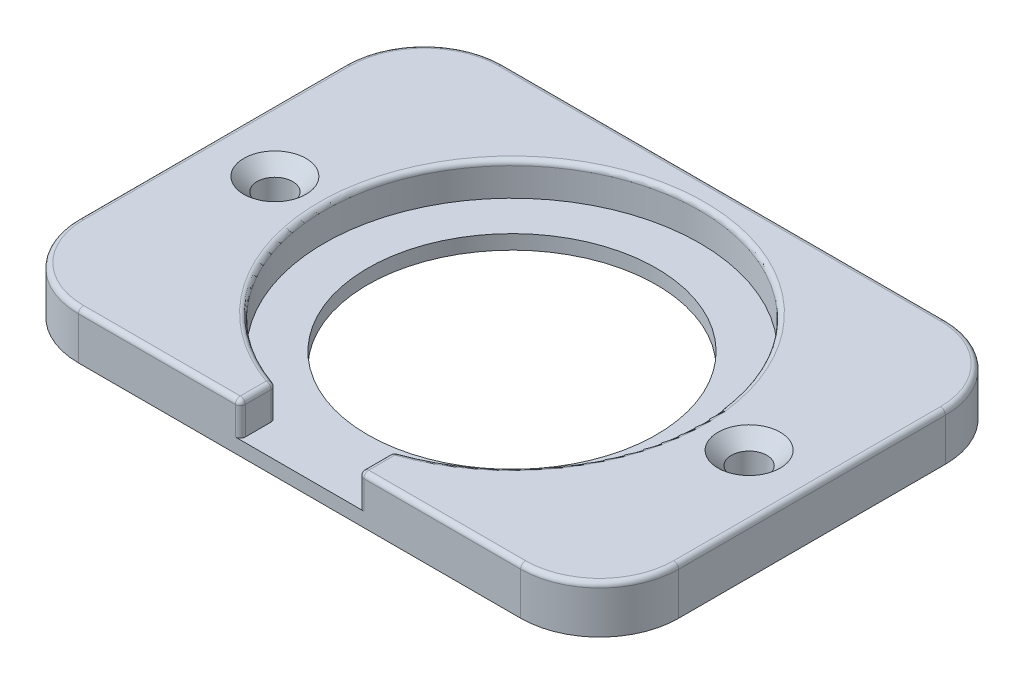
ISO-10303-21;
HEADER;
FILE_DESCRIPTION(('STEP AP214'),'2;1');
FILE_NAME('part.step','',(''),(''),'','','');
FILE_SCHEMA(('AUTOMOTIVE_DESIGN { 1 0 10303 214 1 1 1 1 }'));
ENDSEC;
DATA;
#1=APPLICATION_CONTEXT('core data for automotive mechanical design processes');
#2=APPLICATION_PROTOCOL_DEFINITION('international standard','automotive_design',2000,#1);
#3=PRODUCT_CONTEXT('',#1,'mechanical');
#4=PRODUCT('Part','Part','',(#3));
#5=PRODUCT_RELATED_PRODUCT_CATEGORY('part','',(#4));
#6=PRODUCT_DEFINITION_FORMATION('','',#4);
#7=PRODUCT_DEFINITION_CONTEXT('part definition',#1,'design');
#8=PRODUCT_DEFINITION('design','',#6,#7);
#9=PRODUCT_DEFINITION_SHAPE('','',#8);
#10=(LENGTH_UNIT() NAMED_UNIT(*) SI_UNIT(.MILLI.,.METRE.));
#11=(NAMED_UNIT(*) PLANE_ANGLE_UNIT() SI_UNIT($,.RADIAN.));
#12=(NAMED_UNIT(*) SI_UNIT($,.STERADIAN.) SOLID_ANGLE_UNIT());
#13=UNCERTAINTY_MEASURE_WITH_UNIT(LENGTH_MEASURE(1.E-05),#10,'distance_accuracy_value','');
#14=(GEOMETRIC_REPRESENTATION_CONTEXT(3) GLOBAL_UNCERTAINTY_ASSIGNED_CONTEXT((#13)) GLOBAL_UNIT_ASSIGNED_CONTEXT((#10,
#11,#12)) REPRESENTATION_CONTEXT('',''));
#15=CARTESIAN_POINT('',(0.,0.,0.));
#16=DIRECTION('',(0.,0.,1.));
#17=DIRECTION('',(1.,0.,0.));
#18=AXIS2_PLACEMENT_3D('',#15,#16,#17);
#19=CARTESIAN_POINT('',(30.375,4.8,21.5));
#20=DIRECTION('',(-1.,0.,0.));
#21=DIRECTION('',(0.,0.,1.));
#22=AXIS2_PLACEMENT_3D('',#19,#20,#21);
#23=PLANE('',#22);
#24=DIRECTION('',(0.,-1.,0.));
#25=VECTOR('',#24,1.);
#26=CARTESIAN_POINT('',(30.375,4.8,-13.5));
#27=LINE('',#26,#25);
#28=CARTESIAN_POINT('',(30.375,0.,-13.5));
#29=VERTEX_POINT('',#28);
#30=CARTESIAN_POINT('',(30.375,4.3,-13.5));
#31=VERTEX_POINT('',#30);
#32=EDGE_CURVE('E233',#29,#31,#27,.F.);
#33=ORIENTED_EDGE('',*,*,#32,.T.);
#34=DIRECTION('',(0.,0.,-1.));
#35=VECTOR('',#34,1.);
#36=CARTESIAN_POINT('',(30.375,4.3,21.5));
#37=LINE('',#36,#35);
#38=CARTESIAN_POINT('',(30.375,4.3,13.5));
#39=VERTEX_POINT('',#38);
#40=EDGE_CURVE('E278',#31,#39,#37,.F.);
#41=ORIENTED_EDGE('',*,*,#40,.T.);
#42=DIRECTION('',(0.,-1.,0.));
#43=VECTOR('',#42,1.);
#44=CARTESIAN_POINT('',(30.375,4.8,13.5));
#45=LINE('',#44,#43);
#46=CARTESIAN_POINT('',(30.375,0.,13.5));
#47=VERTEX_POINT('',#46);
#48=EDGE_CURVE('E231',#39,#47,#45,.T.);
#49=ORIENTED_EDGE('',*,*,#48,.T.);
#50=DIRECTION('',(0.,0.,-1.));
#51=VECTOR('',#50,1.);
#52=CARTESIAN_POINT('',(30.375,0.,21.5));
#53=LINE('',#52,#51);
#54=EDGE_CURVE('E220',#47,#29,#53,.T.);
#55=ORIENTED_EDGE('',*,*,#54,.T.);
#56=EDGE_LOOP('',(#33,#41,#49,#55));
#57=FACE_BOUND('',#56,.T.);
#58=ADVANCED_FACE('F37',(#57),#23,.F.);
#59=CARTESIAN_POINT('',(-30.375,4.8,-21.5));
#60=DIRECTION('',(0.,0.,1.));
#61=DIRECTION('',(1.,0.,0.));
#62=AXIS2_PLACEMENT_3D('',#59,#60,#61);
#63=PLANE('',#62);
#64=DIRECTION('',(0.,-1.,0.));
#65=VECTOR('',#64,1.);
#66=CARTESIAN_POINT('',(-22.375,4.8,-21.5));
#67=LINE('',#66,#65);
#68=CARTESIAN_POINT('',(-22.375,0.,-21.5));
#69=VERTEX_POINT('',#68);
#70=CARTESIAN_POINT('',(-22.375,4.3,-21.5));
#71=VERTEX_POINT('',#70);
#72=EDGE_CURVE('E205',#69,#71,#67,.F.);
#73=ORIENTED_EDGE('',*,*,#72,.T.);
#74=DIRECTION('',(-1.,0.,0.));
#75=VECTOR('',#74,1.);
#76=CARTESIAN_POINT('',(-30.375,4.3,-21.5));
#77=LINE('',#76,#75);
#78=CARTESIAN_POINT('',(22.375,4.3,-21.5));
#79=VERTEX_POINT('',#78);
#80=EDGE_CURVE('E282',#71,#79,#77,.F.);
#81=ORIENTED_EDGE('',*,*,#80,.T.);
#82=DIRECTION('',(0.,-1.,0.));
#83=VECTOR('',#82,1.);
#84=CARTESIAN_POINT('',(22.375,4.8,-21.5));
#85=LINE('',#84,#83);
#86=CARTESIAN_POINT('',(22.375,0.,-21.5));
#87=VERTEX_POINT('',#86);
#88=EDGE_CURVE('E209',#79,#87,#85,.T.);
#89=ORIENTED_EDGE('',*,*,#88,.T.);
#90=DIRECTION('',(-1.,0.,0.));
#91=VECTOR('',#90,1.);
#92=CARTESIAN_POINT('',(-30.375,0.,-21.5));
#93=LINE('',#92,#91);
#94=EDGE_CURVE('E216',#87,#69,#93,.T.);
#95=ORIENTED_EDGE('',*,*,#94,.T.);
#96=EDGE_LOOP('',(#73,#81,#89,#95));
#97=FACE_BOUND('',#96,.T.);
#98=ADVANCED_FACE('F452',(#97),#63,.F.);
#99=CARTESIAN_POINT('',(-30.375,4.8,21.5));
#100=DIRECTION('',(1.,0.,0.));
#101=DIRECTION('',(0.,0.,-1.));
#102=AXIS2_PLACEMENT_3D('',#99,#100,#101);
#103=PLANE('',#102);
#104=DIRECTION('',(0.,-1.,0.));
#105=VECTOR('',#104,1.);
#106=CARTESIAN_POINT('',(-30.375,4.8,13.5));
#107=LINE('',#106,#105);
#108=CARTESIAN_POINT('',(-30.375,0.,13.5));
#109=VERTEX_POINT('',#108);
#110=CARTESIAN_POINT('',(-30.375,4.3,13.5));
#111=VERTEX_POINT('',#110);
#112=EDGE_CURVE('E199',#109,#111,#107,.F.);
#113=ORIENTED_EDGE('',*,*,#112,.T.);
#114=DIRECTION('',(0.,0.,1.));
#115=VECTOR('',#114,1.);
#116=CARTESIAN_POINT('',(-30.375,4.3,21.5));
#117=LINE('',#116,#115);
#118=CARTESIAN_POINT('',(-30.375,4.3,-13.5));
#119=VERTEX_POINT('',#118);
#120=EDGE_CURVE('E195',#111,#119,#117,.F.);
#121=ORIENTED_EDGE('',*,*,#120,.T.);
#122=DIRECTION('',(0.,-1.,0.));
#123=VECTOR('',#122,1.);
#124=CARTESIAN_POINT('',(-30.375,4.8,-13.5));
#125=LINE('',#124,#123);
#126=CARTESIAN_POINT('',(-30.375,0.,-13.5));
#127=VERTEX_POINT('',#126);
#128=EDGE_CURVE('E187',#119,#127,#125,.T.);
#129=ORIENTED_EDGE('',*,*,#128,.T.);
#130=DIRECTION('',(0.,0.,1.));
#131=VECTOR('',#130,1.);
#132=CARTESIAN_POINT('',(-30.375,0.,21.5));
#133=LINE('',#132,#131);
#134=EDGE_CURVE('E192',#127,#109,#133,.T.);
#135=ORIENTED_EDGE('',*,*,#134,.T.);
#136=EDGE_LOOP('',(#113,#121,#129,#135));
#137=FACE_BOUND('',#136,.T.);
#138=ADVANCED_FACE('F190',(#137),#103,.F.);
#139=CARTESIAN_POINT('',(-30.375,4.8,21.5));
#140=DIRECTION('',(0.,0.,-1.));
#141=DIRECTION('',(-1.,0.,0.));
#142=AXIS2_PLACEMENT_3D('',#139,#140,#141);
#143=PLANE('',#142);
#144=DIRECTION('',(0.,-1.,0.));
#145=VECTOR('',#144,1.);
#146=CARTESIAN_POINT('',(22.375,4.8,21.5));
#147=LINE('',#146,#145);
#148=CARTESIAN_POINT('',(22.375,0.,21.5));
#149=VERTEX_POINT('',#148);
#150=CARTESIAN_POINT('',(22.375,4.3,21.5));
#151=VERTEX_POINT('',#150);
#152=EDGE_CURVE('E238',#149,#151,#147,.F.);
#153=ORIENTED_EDGE('',*,*,#152,.T.);
#154=DIRECTION('',(1.,0.,0.));
#155=VECTOR('',#154,1.);
#156=CARTESIAN_POINT('',(-30.375,4.3,21.5));
#157=LINE('',#156,#155);
#158=CARTESIAN_POINT('',(6.5,4.3,21.5));
#159=VERTEX_POINT('',#158);
#160=EDGE_CURVE('E273',#151,#159,#157,.F.);
#161=ORIENTED_EDGE('',*,*,#160,.T.);
#162=DIRECTION('',(0.,-1.,0.));
#163=VECTOR('',#162,1.);
#164=CARTESIAN_POINT('',(6.5,4.8,21.5));
#165=LINE('',#164,#163);
#166=CARTESIAN_POINT('',(6.5,1.45,21.5));
#167=VERTEX_POINT('',#166);
#168=EDGE_CURVE('E270',#159,#167,#165,.T.);
#169=ORIENTED_EDGE('',*,*,#168,.T.);
#170=DIRECTION('',(1.,0.,0.));
#171=VECTOR('',#170,1.);
#172=CARTESIAN_POINT('',(-30.375,1.45,21.5));
#173=LINE('',#172,#171);
#174=CARTESIAN_POINT('',(-6.5,1.45,21.5));
#175=VERTEX_POINT('',#174);
#176=EDGE_CURVE('E394',#175,#167,#173,.T.);
#177=ORIENTED_EDGE('',*,*,#176,.F.);
#178=DIRECTION('',(0.,1.,0.));
#179=VECTOR('',#178,1.);
#180=CARTESIAN_POINT('',(-6.5,4.8,21.5));
#181=LINE('',#180,#179);
#182=CARTESIAN_POINT('',(-6.5,4.3,21.5));
#183=VERTEX_POINT('',#182);
#184=EDGE_CURVE('E266',#175,#183,#181,.T.);
#185=ORIENTED_EDGE('',*,*,#184,.T.);
#186=DIRECTION('',(1.,0.,0.));
#187=VECTOR('',#186,1.);
#188=CARTESIAN_POINT('',(-30.375,4.3,21.5));
#189=LINE('',#188,#187);
#190=CARTESIAN_POINT('',(-22.375,4.3,21.5));
#191=VERTEX_POINT('',#190);
#192=EDGE_CURVE('E268',#183,#191,#189,.F.);
#193=ORIENTED_EDGE('',*,*,#192,.T.);
#194=DIRECTION('',(0.,-1.,0.));
#195=VECTOR('',#194,1.);
#196=CARTESIAN_POINT('',(-22.375,4.8,21.5));
#197=LINE('',#196,#195);
#198=CARTESIAN_POINT('',(-22.375,0.,21.5));
#199=VERTEX_POINT('',#198);
#200=EDGE_CURVE('E236',#191,#199,#197,.T.);
#201=ORIENTED_EDGE('',*,*,#200,.T.);
#202=DIRECTION('',(1.,0.,0.));
#203=VECTOR('',#202,1.);
#204=CARTESIAN_POINT('',(-30.375,0.,21.5));
#205=LINE('',#204,#203);
#206=EDGE_CURVE('E215',#199,#149,#205,.T.);
#207=ORIENTED_EDGE('',*,*,#206,.T.);
#208=EDGE_LOOP('',(#153,#161,#169,#177,#185,#193,#201,#207));
#209=FACE_BOUND('',#208,.T.);
#210=ADVANCED_FACE('F430',(#209),#143,.F.);
#211=CARTESIAN_POINT('',(0.,4.8,0.));
#212=DIRECTION('',(0.,-1.,0.));
#213=DIRECTION('',(0.,0.,-1.));
#214=AXIS2_PLACEMENT_3D('',#211,#212,#213);
#215=PLANE('',#214);
#216=DIRECTION('',(0.,0.,1.));
#217=VECTOR('',#216,1.);
#218=CARTESIAN_POINT('',(-6.5,4.8,0.));
#219=LINE('',#218,#217);
#220=CARTESIAN_POINT('',(-6.5,4.8,21.));
#221=VERTEX_POINT('',#220);
#222=CARTESIAN_POINT('',(-6.5,4.8,18.3847763108502));
#223=VERTEX_POINT('',#222);
#224=EDGE_CURVE('E260',#221,#223,#219,.F.);
#225=ORIENTED_EDGE('',*,*,#224,.T.);
#226=CARTESIAN_POINT('',(0.,4.8,0.));
#227=DIRECTION('',(0.,-1.,0.));
#228=DIRECTION('',(0.,0.,-1.));
#229=AXIS2_PLACEMENT_3D('',#226,#227,#228);
#230=CIRCLE('',#229,19.5);
#231=CARTESIAN_POINT('',(6.5,4.8,18.3847763108502));
#232=VERTEX_POINT('',#231);
#233=EDGE_CURVE('E264',#223,#232,#230,.T.);
#234=ORIENTED_EDGE('',*,*,#233,.T.);
#235=DIRECTION('',(0.,0.,-1.));
#236=VECTOR('',#235,1.);
#237=CARTESIAN_POINT('',(6.5,4.8,0.));
#238=LINE('',#237,#236);
#239=CARTESIAN_POINT('',(6.5,4.8,21.));
#240=VERTEX_POINT('',#239);
#241=EDGE_CURVE('E262',#232,#240,#238,.F.);
#242=ORIENTED_EDGE('',*,*,#241,.T.);
#243=DIRECTION('',(1.,0.,0.));
#244=VECTOR('',#243,1.);
#245=CARTESIAN_POINT('',(0.,4.8,21.));
#246=LINE('',#245,#244);
#247=CARTESIAN_POINT('',(22.375,4.8,21.));
#248=VERTEX_POINT('',#247);
#249=EDGE_CURVE('E257',#240,#248,#246,.T.);
#250=ORIENTED_EDGE('',*,*,#249,.T.);
#251=CARTESIAN_POINT('',(22.375,4.8,13.5));
#252=DIRECTION('',(0.,-1.,0.));
#253=DIRECTION('',(0.,0.,-1.));
#254=AXIS2_PLACEMENT_3D('',#251,#252,#253);
#255=CIRCLE('',#254,7.5);
#256=CARTESIAN_POINT('',(29.875,4.8,13.5));
#257=VERTEX_POINT('',#256);
#258=EDGE_CURVE('E255',#248,#257,#255,.F.);
#259=ORIENTED_EDGE('',*,*,#258,.T.);
#260=DIRECTION('',(0.,0.,-1.));
#261=VECTOR('',#260,1.);
#262=CARTESIAN_POINT('',(29.875,4.8,0.));
#263=LINE('',#262,#261);
#264=CARTESIAN_POINT('',(29.875,4.8,-13.5));
#265=VERTEX_POINT('',#264);
#266=EDGE_CURVE('E253',#257,#265,#263,.T.);
#267=ORIENTED_EDGE('',*,*,#266,.T.);
#268=CARTESIAN_POINT('',(22.375,4.8,-13.5));
#269=DIRECTION('',(0.,-1.,0.));
#270=DIRECTION('',(0.,0.,-1.));
#271=AXIS2_PLACEMENT_3D('',#268,#269,#270);
#272=CIRCLE('',#271,7.5);
#273=CARTESIAN_POINT('',(22.375,4.8,-21.));
#274=VERTEX_POINT('',#273);
#275=EDGE_CURVE('E251',#265,#274,#272,.F.);
#276=ORIENTED_EDGE('',*,*,#275,.T.);
#277=DIRECTION('',(-1.,0.,0.));
#278=VECTOR('',#277,1.);
#279=CARTESIAN_POINT('',(0.,4.8,-21.));
#280=LINE('',#279,#278);
#281=CARTESIAN_POINT('',(-22.375,4.8,-21.));
#282=VERTEX_POINT('',#281);
#283=EDGE_CURVE('E249',#274,#282,#280,.T.);
#284=ORIENTED_EDGE('',*,*,#283,.T.);
#285=CARTESIAN_POINT('',(-22.375,4.8,-13.5));
#286=DIRECTION('',(0.,-1.,0.));
#287=DIRECTION('',(0.,0.,-1.));
#288=AXIS2_PLACEMENT_3D('',#285,#286,#287);
#289=CIRCLE('',#288,7.5);
#290=CARTESIAN_POINT('',(-29.875,4.8,-13.5));
#291=VERTEX_POINT('',#290);
#292=EDGE_CURVE('E247',#282,#291,#289,.F.);
#293=ORIENTED_EDGE('',*,*,#292,.T.);
#294=DIRECTION('',(0.,0.,1.));
#295=VECTOR('',#294,1.);
#296=CARTESIAN_POINT('',(-29.875,4.8,0.));
#297=LINE('',#296,#295);
#298=CARTESIAN_POINT('',(-29.875,4.8,13.5));
#299=VERTEX_POINT('',#298);
#300=EDGE_CURVE('E241',#291,#299,#297,.T.);
#301=ORIENTED_EDGE('',*,*,#300,.T.);
#302=CARTESIAN_POINT('',(-22.375,4.8,13.5));
#303=DIRECTION('',(0.,-1.,0.));
#304=DIRECTION('',(0.,0.,-1.));
#305=AXIS2_PLACEMENT_3D('',#302,#303,#304);
#306=CIRCLE('',#305,7.5);
#307=CARTESIAN_POINT('',(-22.375,4.8,21.));
#308=VERTEX_POINT('',#307);
#309=EDGE_CURVE('E243',#299,#308,#306,.F.);
#310=ORIENTED_EDGE('',*,*,#309,.T.);
#311=DIRECTION('',(1.,0.,0.));
#312=VECTOR('',#311,1.);
#313=CARTESIAN_POINT('',(0.,4.8,21.));
#314=LINE('',#313,#312);
#315=EDGE_CURVE('E245',#308,#221,#314,.T.);
#316=ORIENTED_EDGE('',*,*,#315,.T.);
#317=EDGE_LOOP('',(#225,#234,#242,#250,#259,#267,#276,#284,#293,#301,#310,#316));
#318=FACE_BOUND('',#317,.T.);
#319=CARTESIAN_POINT('',(24.,4.8,0.));
#320=DIRECTION('',(0.,1.,0.));
#321=DIRECTION('',(0.,0.,1.));
#322=AXIS2_PLACEMENT_3D('',#319,#320,#321);
#323=CIRCLE('',#322,3.15);
#324=CARTESIAN_POINT('',(24.,4.8,3.15));
#325=VERTEX_POINT('',#324);
#326=EDGE_CURVE('E367',#325,#325,#323,.T.);
#327=ORIENTED_EDGE('',*,*,#326,.F.);
#328=EDGE_LOOP('',(#327));
#329=FACE_BOUND('',#328,.T.);
#330=CARTESIAN_POINT('',(-24.,4.8,0.));
#331=DIRECTION('',(0.,1.,0.));
#332=DIRECTION('',(0.,0.,1.));
#333=AXIS2_PLACEMENT_3D('',#330,#331,#332);
#334=CIRCLE('',#333,3.15);
#335=CARTESIAN_POINT('',(-24.,4.8,3.15));
#336=VERTEX_POINT('',#335);
#337=EDGE_CURVE('E380',#336,#336,#334,.T.);
#338=ORIENTED_EDGE('',*,*,#337,.F.);
#339=EDGE_LOOP('',(#338));
#340=FACE_BOUND('',#339,.T.);
#341=ADVANCED_FACE('F457',(#318,#329,#340),#215,.F.);
#342=CARTESIAN_POINT('',(0.,0.,0.));
#343=DIRECTION('',(0.,-1.,0.));
#344=DIRECTION('',(0.,0.,-1.));
#345=AXIS2_PLACEMENT_3D('',#342,#343,#344);
#346=PLANE('',#345);
#347=CARTESIAN_POINT('',(24.,0.,0.));
#348=DIRECTION('',(0.,1.,0.));
#349=DIRECTION('',(0.,0.,1.));
#350=AXIS2_PLACEMENT_3D('',#347,#348,#349);
#351=CIRCLE('',#350,1.79999999999999);
#352=CARTESIAN_POINT('',(24.,0.,1.79999999999999));
#353=VERTEX_POINT('',#352);
#354=EDGE_CURVE('E375',#353,#353,#351,.T.);
#355=ORIENTED_EDGE('',*,*,#354,.T.);
#356=EDGE_LOOP('',(#355));
#357=FACE_BOUND('',#356,.T.);
#358=CARTESIAN_POINT('',(-24.,0.,0.));
#359=DIRECTION('',(0.,1.,0.));
#360=DIRECTION('',(0.,0.,1.));
#361=AXIS2_PLACEMENT_3D('',#358,#359,#360);
#362=CIRCLE('',#361,1.79999999999999);
#363=CARTESIAN_POINT('',(-24.,0.,1.79999999999999));
#364=VERTEX_POINT('',#363);
#365=EDGE_CURVE('E386',#364,#364,#362,.T.);
#366=ORIENTED_EDGE('',*,*,#365,.T.);
#367=EDGE_LOOP('',(#366));
#368=FACE_BOUND('',#367,.T.);
#369=CARTESIAN_POINT('',(0.,0.,0.));
#370=DIRECTION('',(0.,1.,0.));
#371=DIRECTION('',(0.,0.,1.));
#372=AXIS2_PLACEMENT_3D('',#369,#370,#371);
#373=CIRCLE('',#372,14.61);
#374=CARTESIAN_POINT('',(0.,0.,14.61));
#375=VERTEX_POINT('',#374);
#376=EDGE_CURVE('E397',#375,#375,#373,.T.);
#377=ORIENTED_EDGE('',*,*,#376,.T.);
#378=EDGE_LOOP('',(#377));
#379=FACE_BOUND('',#378,.T.);
#380=ORIENTED_EDGE('',*,*,#134,.F.);
#381=CARTESIAN_POINT('',(-22.375,0.,-13.5));
#382=DIRECTION('',(0.,-1.,0.));
#383=DIRECTION('',(0.,0.,-1.));
#384=AXIS2_PLACEMENT_3D('',#381,#382,#383);
#385=CIRCLE('',#384,8.);
#386=EDGE_CURVE('E202',#127,#69,#385,.T.);
#387=ORIENTED_EDGE('',*,*,#386,.T.);
#388=ORIENTED_EDGE('',*,*,#94,.F.);
#389=CARTESIAN_POINT('',(22.375,0.,-13.5));
#390=DIRECTION('',(0.,-1.,0.));
#391=DIRECTION('',(0.,0.,-1.));
#392=AXIS2_PLACEMENT_3D('',#389,#390,#391);
#393=CIRCLE('',#392,8.);
#394=EDGE_CURVE('E210',#87,#29,#393,.T.);
#395=ORIENTED_EDGE('',*,*,#394,.T.);
#396=ORIENTED_EDGE('',*,*,#54,.F.);
#397=CARTESIAN_POINT('',(22.375,0.,13.5));
#398=DIRECTION('',(0.,-1.,0.));
#399=DIRECTION('',(0.,0.,-1.));
#400=AXIS2_PLACEMENT_3D('',#397,#398,#399);
#401=CIRCLE('',#400,8.);
#402=EDGE_CURVE('E226',#47,#149,#401,.T.);
#403=ORIENTED_EDGE('',*,*,#402,.T.);
#404=ORIENTED_EDGE('',*,*,#206,.F.);
#405=CARTESIAN_POINT('',(-22.375,0.,13.5));
#406=DIRECTION('',(0.,-1.,0.));
#407=DIRECTION('',(0.,0.,-1.));
#408=AXIS2_PLACEMENT_3D('',#405,#406,#407);
#409=CIRCLE('',#408,8.);
#410=EDGE_CURVE('E198',#199,#109,#409,.T.);
#411=ORIENTED_EDGE('',*,*,#410,.T.);
#412=EDGE_LOOP('',(#380,#387,#388,#395,#396,#403,#404,#411));
#413=FACE_BOUND('',#412,.T.);
#414=ADVANCED_FACE('F212',(#357,#368,#379,#413),#346,.T.);
#415=CARTESIAN_POINT('',(-22.375,4.8,-13.5));
#416=DIRECTION('',(0.,-1.,0.));
#417=DIRECTION('',(0.,0.,-1.));
#418=AXIS2_PLACEMENT_3D('',#415,#416,#417);
#419=CYLINDRICAL_SURFACE('',#418,8.);
#420=ORIENTED_EDGE('',*,*,#128,.F.);
#421=CARTESIAN_POINT('',(-22.375,4.3,-13.5));
#422=DIRECTION('',(0.,-1.,0.));
#423=DIRECTION('',(0.,0.,-1.));
#424=AXIS2_PLACEMENT_3D('',#421,#422,#423);
#425=CIRCLE('',#424,8.);
#426=EDGE_CURVE('E284',#119,#71,#425,.T.);
#427=ORIENTED_EDGE('',*,*,#426,.T.);
#428=ORIENTED_EDGE('',*,*,#72,.F.);
#429=ORIENTED_EDGE('',*,*,#386,.F.);
#430=EDGE_LOOP('',(#420,#427,#428,#429));
#431=FACE_BOUND('',#430,.T.);
#432=ADVANCED_FACE('F203',(#431),#419,.T.);
#433=CARTESIAN_POINT('',(22.375,4.8,-13.5));
#434=DIRECTION('',(0.,-1.,0.));
#435=DIRECTION('',(0.,0.,-1.));
#436=AXIS2_PLACEMENT_3D('',#433,#434,#435);
#437=CYLINDRICAL_SURFACE('',#436,8.);
#438=ORIENTED_EDGE('',*,*,#88,.F.);
#439=CARTESIAN_POINT('',(22.375,4.3,-13.5));
#440=DIRECTION('',(0.,-1.,0.));
#441=DIRECTION('',(0.,0.,-1.));
#442=AXIS2_PLACEMENT_3D('',#439,#440,#441);
#443=CIRCLE('',#442,8.);
#444=EDGE_CURVE('E280',#79,#31,#443,.T.);
#445=ORIENTED_EDGE('',*,*,#444,.T.);
#446=ORIENTED_EDGE('',*,*,#32,.F.);
#447=ORIENTED_EDGE('',*,*,#394,.F.);
#448=EDGE_LOOP('',(#438,#445,#446,#447));
#449=FACE_BOUND('',#448,.T.);
#450=ADVANCED_FACE('F414',(#449),#437,.T.);
#451=CARTESIAN_POINT('',(22.375,4.8,13.5));
#452=DIRECTION('',(0.,-1.,0.));
#453=DIRECTION('',(0.,0.,-1.));
#454=AXIS2_PLACEMENT_3D('',#451,#452,#453);
#455=CYLINDRICAL_SURFACE('',#454,8.);
#456=ORIENTED_EDGE('',*,*,#48,.F.);
#457=CARTESIAN_POINT('',(22.375,4.3,13.5));
#458=DIRECTION('',(0.,-1.,0.));
#459=DIRECTION('',(0.,0.,-1.));
#460=AXIS2_PLACEMENT_3D('',#457,#458,#459);
#461=CIRCLE('',#460,8.);
#462=EDGE_CURVE('E276',#39,#151,#461,.T.);
#463=ORIENTED_EDGE('',*,*,#462,.T.);
#464=ORIENTED_EDGE('',*,*,#152,.F.);
#465=ORIENTED_EDGE('',*,*,#402,.F.);
#466=EDGE_LOOP('',(#456,#463,#464,#465));
#467=FACE_BOUND('',#466,.T.);
#468=ADVANCED_FACE('F427',(#467),#455,.T.);
#469=CARTESIAN_POINT('',(-22.375,4.8,13.5));
#470=DIRECTION('',(0.,-1.,0.));
#471=DIRECTION('',(0.,0.,-1.));
#472=AXIS2_PLACEMENT_3D('',#469,#470,#471);
#473=CYLINDRICAL_SURFACE('',#472,8.);
#474=ORIENTED_EDGE('',*,*,#200,.F.);
#475=CARTESIAN_POINT('',(-22.375,4.3,13.5));
#476=DIRECTION('',(0.,-1.,0.));
#477=DIRECTION('',(0.,0.,-1.));
#478=AXIS2_PLACEMENT_3D('',#475,#476,#477);
#479=CIRCLE('',#478,8.);
#480=EDGE_CURVE('E286',#191,#111,#479,.T.);
#481=ORIENTED_EDGE('',*,*,#480,.T.);
#482=ORIENTED_EDGE('',*,*,#112,.F.);
#483=ORIENTED_EDGE('',*,*,#410,.F.);
#484=EDGE_LOOP('',(#474,#481,#482,#483));
#485=FACE_BOUND('',#484,.T.);
#486=ADVANCED_FACE('F436',(#485),#473,.T.);
#487=CARTESIAN_POINT('',(0.,1.45,0.));
#488=DIRECTION('',(0.,1.,0.));
#489=DIRECTION('',(0.,0.,1.));
#490=AXIS2_PLACEMENT_3D('',#487,#488,#489);
#491=CYLINDRICAL_SURFACE('',#490,19.);
#492=CARTESIAN_POINT('',(0.,1.45,0.));
#493=DIRECTION('',(0.,1.,0.));
#494=DIRECTION('',(0.,0.,1.));
#495=AXIS2_PLACEMENT_3D('',#492,#493,#494);
#496=CIRCLE('',#495,19.);
#497=CARTESIAN_POINT('',(6.33333333333333,1.45,17.9133717900592));
#498=VERTEX_POINT('',#497);
#499=CARTESIAN_POINT('',(-6.33333333333333,1.45,17.9133717900592));
#500=VERTEX_POINT('',#499);
#501=EDGE_CURVE('E400',#498,#500,#496,.T.);
#502=ORIENTED_EDGE('',*,*,#501,.F.);
#503=DIRECTION('',(0.,1.,0.));
#504=VECTOR('',#503,1.);
#505=CARTESIAN_POINT('',(6.33333333333333,1.45,17.9133717900592));
#506=LINE('',#505,#504);
#507=CARTESIAN_POINT('',(6.33333333333333,4.3,17.9133717900592));
#508=VERTEX_POINT('',#507);
#509=EDGE_CURVE('E298',#498,#508,#506,.T.);
#510=ORIENTED_EDGE('',*,*,#509,.T.);
#511=CARTESIAN_POINT('',(0.,4.3,0.));
#512=DIRECTION('',(0.,-1.,0.));
#513=DIRECTION('',(0.,0.,-1.));
#514=AXIS2_PLACEMENT_3D('',#511,#512,#513);
#515=CIRCLE('',#514,19.);
#516=CARTESIAN_POINT('',(-6.33333333333333,4.3,17.9133717900592));
#517=VERTEX_POINT('',#516);
#518=EDGE_CURVE('E294',#508,#517,#515,.F.);
#519=ORIENTED_EDGE('',*,*,#518,.T.);
#520=DIRECTION('',(0.,1.,0.));
#521=VECTOR('',#520,1.);
#522=CARTESIAN_POINT('',(-6.33333333333333,1.45,17.9133717900592));
#523=LINE('',#522,#521);
#524=EDGE_CURVE('E296',#517,#500,#523,.F.);
#525=ORIENTED_EDGE('',*,*,#524,.T.);
#526=EDGE_LOOP('',(#502,#510,#519,#525));
#527=FACE_BOUND('',#526,.T.);
#528=ADVANCED_FACE('F504',(#527),#491,.F.);
#529=CARTESIAN_POINT('',(0.,1.45,0.));
#530=DIRECTION('',(0.,1.,0.));
#531=DIRECTION('',(0.,0.,1.));
#532=AXIS2_PLACEMENT_3D('',#529,#530,#531);
#533=PLANE('',#532);
#534=DIRECTION('',(0.,0.,1.));
#535=VECTOR('',#534,1.);
#536=CARTESIAN_POINT('',(6.,1.45,24.5145352956609));
#537=LINE('',#536,#535);
#538=CARTESIAN_POINT('',(6.,1.45,18.3847763108502));
#539=VERTEX_POINT('',#538);
#540=CARTESIAN_POINT('',(6.,1.45,21.));
#541=VERTEX_POINT('',#540);
#542=EDGE_CURVE('E391',#539,#541,#537,.T.);
#543=ORIENTED_EDGE('',*,*,#542,.F.);
#544=CARTESIAN_POINT('',(6.5,1.45,18.3847763108502));
#545=DIRECTION('',(0.,1.,0.));
#546=DIRECTION('',(0.,0.,1.));
#547=AXIS2_PLACEMENT_3D('',#544,#545,#546);
#548=CIRCLE('',#547,0.5);
#549=EDGE_CURVE('E307',#539,#498,#548,.F.);
#550=ORIENTED_EDGE('',*,*,#549,.T.);
#551=ORIENTED_EDGE('',*,*,#501,.T.);
#552=CARTESIAN_POINT('',(-6.5,1.45,18.3847763108502));
#553=DIRECTION('',(0.,1.,0.));
#554=DIRECTION('',(0.,0.,1.));
#555=AXIS2_PLACEMENT_3D('',#552,#553,#554);
#556=CIRCLE('',#555,0.5);
#557=CARTESIAN_POINT('',(-6.,1.45,18.3847763108502));
#558=VERTEX_POINT('',#557);
#559=EDGE_CURVE('E46',#500,#558,#556,.F.);
#560=ORIENTED_EDGE('',*,*,#559,.T.);
#561=DIRECTION('',(0.,0.,-1.));
#562=VECTOR('',#561,1.);
#563=CARTESIAN_POINT('',(-6.,1.45,24.5145352956609));
#564=LINE('',#563,#562);
#565=CARTESIAN_POINT('',(-6.,1.45,21.));
#566=VERTEX_POINT('',#565);
#567=EDGE_CURVE('E389',#566,#558,#564,.T.);
#568=ORIENTED_EDGE('',*,*,#567,.F.);
#569=CARTESIAN_POINT('',(-6.5,1.45,21.));
#570=DIRECTION('',(0.,1.,0.));
#571=DIRECTION('',(0.,0.,1.));
#572=AXIS2_PLACEMENT_3D('',#569,#570,#571);
#573=CIRCLE('',#572,0.5);
#574=EDGE_CURVE('E11',#566,#175,#573,.F.);
#575=ORIENTED_EDGE('',*,*,#574,.T.);
#576=ORIENTED_EDGE('',*,*,#176,.T.);
#577=CARTESIAN_POINT('',(6.5,1.45,21.));
#578=DIRECTION('',(0.,1.,0.));
#579=DIRECTION('',(0.,0.,1.));
#580=AXIS2_PLACEMENT_3D('',#577,#578,#579);
#581=CIRCLE('',#580,0.5);
#582=EDGE_CURVE('E305',#167,#541,#581,.F.);
#583=ORIENTED_EDGE('',*,*,#582,.T.);
#584=EDGE_LOOP('',(#543,#550,#551,#560,#568,#575,#576,#583));
#585=FACE_BOUND('',#584,.T.);
#586=CARTESIAN_POINT('',(0.,1.45,0.));
#587=DIRECTION('',(0.,1.,0.));
#588=DIRECTION('',(0.,0.,1.));
#589=AXIS2_PLACEMENT_3D('',#586,#587,#588);
#590=CIRCLE('',#589,14.61);
#591=CARTESIAN_POINT('',(0.,1.45,14.61));
#592=VERTEX_POINT('',#591);
#593=EDGE_CURVE('E396',#592,#592,#590,.T.);
#594=ORIENTED_EDGE('',*,*,#593,.F.);
#595=EDGE_LOOP('',(#594));
#596=FACE_BOUND('',#595,.T.);
#597=ADVANCED_FACE('F475',(#585,#596),#533,.T.);
#598=CARTESIAN_POINT('',(0.,0.,0.));
#599=DIRECTION('',(0.,1.,0.));
#600=DIRECTION('',(0.,0.,1.));
#601=AXIS2_PLACEMENT_3D('',#598,#599,#600);
#602=CYLINDRICAL_SURFACE('',#601,14.61);
#603=ORIENTED_EDGE('',*,*,#376,.F.);
#604=EDGE_LOOP('',(#603));
#605=FACE_BOUND('',#604,.T.);
#606=ORIENTED_EDGE('',*,*,#593,.T.);
#607=EDGE_LOOP('',(#606));
#608=FACE_BOUND('',#607,.T.);
#609=ADVANCED_FACE('F743',(#605,#608),#602,.F.);
#610=CARTESIAN_POINT('',(6.,-14.848478398561,24.5145352956609));
#611=DIRECTION('',(1.,0.,0.));
#612=DIRECTION('',(0.,0.,-1.));
#613=AXIS2_PLACEMENT_3D('',#610,#611,#612);
#614=PLANE('',#613);
#615=ORIENTED_EDGE('',*,*,#542,.T.);
#616=DIRECTION('',(0.,-1.,0.));
#617=VECTOR('',#616,1.);
#618=CARTESIAN_POINT('',(6.,-14.848478398561,21.));
#619=LINE('',#618,#617);
#620=CARTESIAN_POINT('',(6.,4.3,21.));
#621=VERTEX_POINT('',#620);
#622=EDGE_CURVE('E292',#541,#621,#619,.F.);
#623=ORIENTED_EDGE('',*,*,#622,.T.);
#624=DIRECTION('',(0.,0.,-1.));
#625=VECTOR('',#624,1.);
#626=CARTESIAN_POINT('',(6.,4.3,24.5145352956609));
#627=LINE('',#626,#625);
#628=CARTESIAN_POINT('',(6.,4.3,18.3847763108502));
#629=VERTEX_POINT('',#628);
#630=EDGE_CURVE('E288',#621,#629,#627,.T.);
#631=ORIENTED_EDGE('',*,*,#630,.T.);
#632=DIRECTION('',(0.,1.,0.));
#633=VECTOR('',#632,1.);
#634=CARTESIAN_POINT('',(6.,-14.848478398561,18.3847763108502));
#635=LINE('',#634,#633);
#636=EDGE_CURVE('E290',#629,#539,#635,.F.);
#637=ORIENTED_EDGE('',*,*,#636,.T.);
#638=EDGE_LOOP('',(#615,#623,#631,#637));
#639=FACE_BOUND('',#638,.T.);
#640=ADVANCED_FACE('F479',(#639),#614,.F.);
#641=CARTESIAN_POINT('',(-6.,-14.848478398561,24.5145352956609));
#642=DIRECTION('',(-1.,0.,0.));
#643=DIRECTION('',(0.,0.,1.));
#644=AXIS2_PLACEMENT_3D('',#641,#642,#643);
#645=PLANE('',#644);
#646=ORIENTED_EDGE('',*,*,#567,.T.);
#647=DIRECTION('',(0.,1.,0.));
#648=VECTOR('',#647,1.);
#649=CARTESIAN_POINT('',(-6.,-14.848478398561,18.3847763108502));
#650=LINE('',#649,#648);
#651=CARTESIAN_POINT('',(-6.,4.3,18.3847763108502));
#652=VERTEX_POINT('',#651);
#653=EDGE_CURVE('E59',#558,#652,#650,.T.);
#654=ORIENTED_EDGE('',*,*,#653,.T.);
#655=DIRECTION('',(0.,0.,1.));
#656=VECTOR('',#655,1.);
#657=CARTESIAN_POINT('',(-6.,4.3,24.5145352956609));
#658=LINE('',#657,#656);
#659=CARTESIAN_POINT('',(-6.,4.3,21.));
#660=VERTEX_POINT('',#659);
#661=EDGE_CURVE('E54',#652,#660,#658,.T.);
#662=ORIENTED_EDGE('',*,*,#661,.T.);
#663=DIRECTION('',(0.,1.,0.));
#664=VECTOR('',#663,1.);
#665=CARTESIAN_POINT('',(-6.,-14.848478398561,21.));
#666=LINE('',#665,#664);
#667=EDGE_CURVE('E301',#660,#566,#666,.F.);
#668=ORIENTED_EDGE('',*,*,#667,.T.);
#669=EDGE_LOOP('',(#646,#654,#662,#668));
#670=FACE_BOUND('',#669,.T.);
#671=ADVANCED_FACE('F727',(#670),#645,.F.);
#672=CARTESIAN_POINT('',(-24.,4.8,0.));
#673=DIRECTION('',(0.,1.,0.));
#674=DIRECTION('',(0.,0.,1.));
#675=AXIS2_PLACEMENT_3D('',#672,#673,#674);
#676=CYLINDRICAL_SURFACE('',#675,1.79999999999999);
#677=ORIENTED_EDGE('',*,*,#365,.F.);
#678=EDGE_LOOP('',(#677));
#679=FACE_BOUND('',#678,.T.);
#680=CARTESIAN_POINT('',(-24.,3.45,0.));
#681=DIRECTION('',(0.,1.,0.));
#682=DIRECTION('',(0.,0.,1.));
#683=AXIS2_PLACEMENT_3D('',#680,#681,#682);
#684=CIRCLE('',#683,1.79999999999999);
#685=CARTESIAN_POINT('',(-24.,3.45,1.79999999999999));
#686=VERTEX_POINT('',#685);
#687=EDGE_CURVE('E383',#686,#686,#684,.T.);
#688=ORIENTED_EDGE('',*,*,#687,.T.);
#689=EDGE_LOOP('',(#688));
#690=FACE_BOUND('',#689,.T.);
#691=ADVANCED_FACE('F718',(#679,#690),#676,.F.);
#692=CARTESIAN_POINT('',(-24.,4.8,0.));
#693=DIRECTION('',(0.,1.,0.));
#694=DIRECTION('',(0.,0.,1.));
#695=AXIS2_PLACEMENT_3D('',#692,#693,#694);
#696=CONICAL_SURFACE('',#695,3.15,0.785398163397449);
#697=ORIENTED_EDGE('',*,*,#687,.F.);
#698=EDGE_LOOP('',(#697));
#699=FACE_BOUND('',#698,.T.);
#700=ORIENTED_EDGE('',*,*,#337,.T.);
#701=EDGE_LOOP('',(#700));
#702=FACE_BOUND('',#701,.T.);
#703=ADVANCED_FACE('F708',(#699,#702),#696,.F.);
#704=CARTESIAN_POINT('',(24.,4.8,0.));
#705=DIRECTION('',(0.,1.,0.));
#706=DIRECTION('',(0.,0.,1.));
#707=AXIS2_PLACEMENT_3D('',#704,#705,#706);
#708=CYLINDRICAL_SURFACE('',#707,1.79999999999999);
#709=ORIENTED_EDGE('',*,*,#354,.F.);
#710=EDGE_LOOP('',(#709));
#711=FACE_BOUND('',#710,.T.);
#712=CARTESIAN_POINT('',(24.,3.45,0.));
#713=DIRECTION('',(0.,1.,0.));
#714=DIRECTION('',(0.,0.,1.));
#715=AXIS2_PLACEMENT_3D('',#712,#713,#714);
#716=CIRCLE('',#715,1.79999999999999);
#717=CARTESIAN_POINT('',(24.,3.45,1.79999999999999));
#718=VERTEX_POINT('',#717);
#719=EDGE_CURVE('E370',#718,#718,#716,.T.);
#720=ORIENTED_EDGE('',*,*,#719,.T.);
#721=EDGE_LOOP('',(#720));
#722=FACE_BOUND('',#721,.T.);
#723=ADVANCED_FACE('F698',(#711,#722),#708,.F.);
#724=CARTESIAN_POINT('',(24.,4.8,0.));
#725=DIRECTION('',(0.,1.,0.));
#726=DIRECTION('',(0.,0.,1.));
#727=AXIS2_PLACEMENT_3D('',#724,#725,#726);
#728=CONICAL_SURFACE('',#727,3.15,0.785398163397449);
#729=ORIENTED_EDGE('',*,*,#719,.F.);
#730=EDGE_LOOP('',(#729));
#731=FACE_BOUND('',#730,.T.);
#732=ORIENTED_EDGE('',*,*,#326,.T.);
#733=EDGE_LOOP('',(#732));
#734=FACE_BOUND('',#733,.T.);
#735=ADVANCED_FACE('F689',(#731,#734),#728,.F.);
#736=CARTESIAN_POINT('',(-6.5,4.8,21.));
#737=DIRECTION('',(0.,1.,0.));
#738=DIRECTION('',(0.,0.,1.));
#739=AXIS2_PLACEMENT_3D('',#736,#737,#738);
#740=CYLINDRICAL_SURFACE('',#739,0.5);
#741=ORIENTED_EDGE('',*,*,#574,.F.);
#742=ORIENTED_EDGE('',*,*,#667,.F.);
#743=CARTESIAN_POINT('',(-6.5,4.3,21.));
#744=DIRECTION('',(0.,1.,0.));
#745=DIRECTION('',(-1.,0.,0.));
#746=AXIS2_PLACEMENT_3D('',#743,#744,#745);
#747=CIRCLE('',#746,0.5);
#748=EDGE_CURVE('E41',#183,#660,#747,.T.);
#749=ORIENTED_EDGE('',*,*,#748,.F.);
#750=ORIENTED_EDGE('',*,*,#184,.F.);
#751=EDGE_LOOP('',(#741,#742,#749,#750));
#752=FACE_BOUND('',#751,.T.);
#753=ADVANCED_FACE('F39',(#752),#740,.T.);
#754=CARTESIAN_POINT('',(0.,4.3,21.));
#755=DIRECTION('',(1.,0.,0.));
#756=DIRECTION('',(0.,0.,-1.));
#757=AXIS2_PLACEMENT_3D('',#754,#755,#756);
#758=CYLINDRICAL_SURFACE('',#757,0.5);
#759=CARTESIAN_POINT('',(-22.375,4.3,21.));
#760=DIRECTION('',(-1.,0.,0.));
#761=DIRECTION('',(0.,0.,1.));
#762=AXIS2_PLACEMENT_3D('',#759,#760,#761);
#763=CIRCLE('',#762,0.5);
#764=EDGE_CURVE('E359',#191,#308,#763,.T.);
#765=ORIENTED_EDGE('',*,*,#764,.F.);
#766=ORIENTED_EDGE('',*,*,#192,.F.);
#767=CARTESIAN_POINT('',(-6.5,4.3,21.));
#768=DIRECTION('',(1.,0.,0.));
#769=DIRECTION('',(0.,0.,-1.));
#770=AXIS2_PLACEMENT_3D('',#767,#768,#769);
#771=CIRCLE('',#770,0.5);
#772=EDGE_CURVE('E361',#221,#183,#771,.T.);
#773=ORIENTED_EDGE('',*,*,#772,.F.);
#774=ORIENTED_EDGE('',*,*,#315,.F.);
#775=EDGE_LOOP('',(#765,#766,#773,#774));
#776=FACE_BOUND('',#775,.T.);
#777=ADVANCED_FACE('F515',(#776),#758,.T.);
#778=CARTESIAN_POINT('',(-6.5,4.3,21.));
#779=DIRECTION('',(0.,0.,1.));
#780=DIRECTION('',(1.,0.,0.));
#781=AXIS2_PLACEMENT_3D('',#778,#779,#780);
#782=SPHERICAL_SURFACE('',#781,0.5);
#783=ORIENTED_EDGE('',*,*,#772,.T.);
#784=ORIENTED_EDGE('',*,*,#748,.T.);
#785=CARTESIAN_POINT('',(-6.5,4.3,21.));
#786=DIRECTION('',(0.,0.,1.));
#787=DIRECTION('',(1.,0.,0.));
#788=AXIS2_PLACEMENT_3D('',#785,#786,#787);
#789=CIRCLE('',#788,0.5);
#790=EDGE_CURVE('E356',#221,#660,#789,.F.);
#791=ORIENTED_EDGE('',*,*,#790,.F.);
#792=EDGE_LOOP('',(#783,#784,#791));
#793=FACE_BOUND('',#792,.T.);
#794=ADVANCED_FACE('F513',(#793),#782,.T.);
#795=CARTESIAN_POINT('',(-22.375,4.3,13.5));
#796=DIRECTION('',(0.,-1.,0.));
#797=DIRECTION('',(0.,0.,-1.));
#798=AXIS2_PLACEMENT_3D('',#795,#796,#797);
#799=TOROIDAL_SURFACE('',#798,7.5,0.5);
#800=ORIENTED_EDGE('',*,*,#764,.T.);
#801=ORIENTED_EDGE('',*,*,#309,.F.);
#802=CARTESIAN_POINT('',(-29.875,4.3,13.5));
#803=DIRECTION('',(0.,0.,-1.));
#804=DIRECTION('',(-1.,0.,0.));
#805=AXIS2_PLACEMENT_3D('',#802,#803,#804);
#806=CIRCLE('',#805,0.5);
#807=EDGE_CURVE('E353',#111,#299,#806,.T.);
#808=ORIENTED_EDGE('',*,*,#807,.F.);
#809=ORIENTED_EDGE('',*,*,#480,.F.);
#810=EDGE_LOOP('',(#800,#801,#808,#809));
#811=FACE_BOUND('',#810,.T.);
#812=ADVANCED_FACE('F441',(#811),#799,.T.);
#813=CARTESIAN_POINT('',(-6.5,1.45,18.3847763108502));
#814=DIRECTION('',(0.,1.,0.));
#815=DIRECTION('',(0.,0.,1.));
#816=AXIS2_PLACEMENT_3D('',#813,#814,#815);
#817=CYLINDRICAL_SURFACE('',#816,0.5);
#818=ORIENTED_EDGE('',*,*,#559,.F.);
#819=ORIENTED_EDGE('',*,*,#524,.F.);
#820=CARTESIAN_POINT('',(-6.5,4.3,18.3847763108502));
#821=DIRECTION('',(0.,1.,0.));
#822=DIRECTION('',(0.,0.,1.));
#823=AXIS2_PLACEMENT_3D('',#820,#821,#822);
#824=CIRCLE('',#823,0.5);
#825=EDGE_CURVE('E350',#652,#517,#824,.T.);
#826=ORIENTED_EDGE('',*,*,#825,.F.);
#827=ORIENTED_EDGE('',*,*,#653,.F.);
#828=EDGE_LOOP('',(#818,#819,#826,#827));
#829=FACE_BOUND('',#828,.T.);
#830=ADVANCED_FACE('F508',(#829),#817,.T.);
#831=CARTESIAN_POINT('',(-6.5,4.3,24.5145352956609));
#832=DIRECTION('',(0.,0.,1.));
#833=DIRECTION('',(1.,0.,0.));
#834=AXIS2_PLACEMENT_3D('',#831,#832,#833);
#835=CYLINDRICAL_SURFACE('',#834,0.5);
#836=ORIENTED_EDGE('',*,*,#790,.T.);
#837=ORIENTED_EDGE('',*,*,#661,.F.);
#838=CARTESIAN_POINT('',(-6.5,4.3,18.3847763108502));
#839=DIRECTION('',(0.,0.,-1.));
#840=DIRECTION('',(-1.,0.,0.));
#841=AXIS2_PLACEMENT_3D('',#838,#839,#840);
#842=CIRCLE('',#841,0.5);
#843=EDGE_CURVE('E347',#223,#652,#842,.T.);
#844=ORIENTED_EDGE('',*,*,#843,.F.);
#845=ORIENTED_EDGE('',*,*,#224,.F.);
#846=EDGE_LOOP('',(#836,#837,#844,#845));
#847=FACE_BOUND('',#846,.T.);
#848=ADVANCED_FACE('F512',(#847),#835,.T.);
#849=CARTESIAN_POINT('',(-29.875,4.3,0.));
#850=DIRECTION('',(0.,0.,1.));
#851=DIRECTION('',(1.,0.,0.));
#852=AXIS2_PLACEMENT_3D('',#849,#850,#851);
#853=CYLINDRICAL_SURFACE('',#852,0.5);
#854=ORIENTED_EDGE('',*,*,#807,.T.);
#855=ORIENTED_EDGE('',*,*,#300,.F.);
#856=CARTESIAN_POINT('',(-29.875,4.3,-13.5));
#857=DIRECTION('',(0.,0.,-1.));
#858=DIRECTION('',(-1.,0.,0.));
#859=AXIS2_PLACEMENT_3D('',#856,#857,#858);
#860=CIRCLE('',#859,0.5);
#861=EDGE_CURVE('E344',#119,#291,#860,.T.);
#862=ORIENTED_EDGE('',*,*,#861,.F.);
#863=ORIENTED_EDGE('',*,*,#120,.F.);
#864=EDGE_LOOP('',(#854,#855,#862,#863));
#865=FACE_BOUND('',#864,.T.);
#866=ADVANCED_FACE('F444',(#865),#853,.T.);
#867=CARTESIAN_POINT('',(-6.5,4.3,18.3847763108502));
#868=DIRECTION('',(0.,0.,1.));
#869=DIRECTION('',(1.,0.,0.));
#870=AXIS2_PLACEMENT_3D('',#867,#868,#869);
#871=SPHERICAL_SURFACE('',#870,0.5);
#872=ORIENTED_EDGE('',*,*,#843,.T.);
#873=ORIENTED_EDGE('',*,*,#825,.T.);
#874=CARTESIAN_POINT('',(-6.5,4.3,18.3847763108502));
#875=DIRECTION('',(0.942809041582063,0.,0.333333333333334));
#876=DIRECTION('',(0.333333333333334,0.,-0.942809041582063));
#877=AXIS2_PLACEMENT_3D('',#874,#875,#876);
#878=CIRCLE('',#877,0.5);
#879=EDGE_CURVE('E341',#223,#517,#878,.F.);
#880=ORIENTED_EDGE('',*,*,#879,.F.);
#881=EDGE_LOOP('',(#872,#873,#880));
#882=FACE_BOUND('',#881,.T.);
#883=ADVANCED_FACE('F510',(#882),#871,.T.);
#884=CARTESIAN_POINT('',(-22.375,4.3,-13.5));
#885=DIRECTION('',(0.,-1.,0.));
#886=DIRECTION('',(0.,0.,-1.));
#887=AXIS2_PLACEMENT_3D('',#884,#885,#886);
#888=TOROIDAL_SURFACE('',#887,7.5,0.5);
#889=ORIENTED_EDGE('',*,*,#861,.T.);
#890=ORIENTED_EDGE('',*,*,#292,.F.);
#891=CARTESIAN_POINT('',(-22.375,4.3,-21.));
#892=DIRECTION('',(1.,0.,0.));
#893=DIRECTION('',(0.,0.,-1.));
#894=AXIS2_PLACEMENT_3D('',#891,#892,#893);
#895=CIRCLE('',#894,0.5);
#896=EDGE_CURVE('E338',#71,#282,#895,.T.);
#897=ORIENTED_EDGE('',*,*,#896,.F.);
#898=ORIENTED_EDGE('',*,*,#426,.F.);
#899=EDGE_LOOP('',(#889,#890,#897,#898));
#900=FACE_BOUND('',#899,.T.);
#901=ADVANCED_FACE('F449',(#900),#888,.T.);
#902=CARTESIAN_POINT('',(6.5,1.45,18.3847763108502));
#903=DIRECTION('',(0.,1.,0.));
#904=DIRECTION('',(0.,0.,1.));
#905=AXIS2_PLACEMENT_3D('',#902,#903,#904);
#906=CYLINDRICAL_SURFACE('',#905,0.5);
#907=ORIENTED_EDGE('',*,*,#549,.F.);
#908=ORIENTED_EDGE('',*,*,#636,.F.);
#909=CARTESIAN_POINT('',(6.5,4.3,18.3847763108502));
#910=DIRECTION('',(0.,1.,0.));
#911=DIRECTION('',(-1.,0.,0.));
#912=AXIS2_PLACEMENT_3D('',#909,#910,#911);
#913=CIRCLE('',#912,0.5);
#914=EDGE_CURVE('E335',#508,#629,#913,.T.);
#915=ORIENTED_EDGE('',*,*,#914,.F.);
#916=ORIENTED_EDGE('',*,*,#509,.F.);
#917=EDGE_LOOP('',(#907,#908,#915,#916));
#918=FACE_BOUND('',#917,.T.);
#919=ADVANCED_FACE('F484',(#918),#906,.T.);
#920=CARTESIAN_POINT('',(0.,4.3,0.));
#921=DIRECTION('',(0.,-1.,0.));
#922=DIRECTION('',(0.,0.,-1.));
#923=AXIS2_PLACEMENT_3D('',#920,#921,#922);
#924=TOROIDAL_SURFACE('',#923,19.5,0.5);
#925=ORIENTED_EDGE('',*,*,#879,.T.);
#926=ORIENTED_EDGE('',*,*,#518,.F.);
#927=CARTESIAN_POINT('',(6.5,4.3,18.3847763108502));
#928=DIRECTION('',(-0.942809041582063,0.,0.333333333333334));
#929=DIRECTION('',(0.333333333333334,0.,0.942809041582063));
#930=AXIS2_PLACEMENT_3D('',#927,#928,#929);
#931=CIRCLE('',#930,0.5);
#932=EDGE_CURVE('E332',#232,#508,#931,.T.);
#933=ORIENTED_EDGE('',*,*,#932,.F.);
#934=ORIENTED_EDGE('',*,*,#233,.F.);
#935=EDGE_LOOP('',(#925,#926,#933,#934));
#936=FACE_BOUND('',#935,.T.);
#937=ADVANCED_FACE('F499',(#936),#924,.T.);
#938=CARTESIAN_POINT('',(0.,4.3,-21.));
#939=DIRECTION('',(-1.,0.,0.));
#940=DIRECTION('',(0.,0.,1.));
#941=AXIS2_PLACEMENT_3D('',#938,#939,#940);
#942=CYLINDRICAL_SURFACE('',#941,0.5);
#943=ORIENTED_EDGE('',*,*,#896,.T.);
#944=ORIENTED_EDGE('',*,*,#283,.F.);
#945=CARTESIAN_POINT('',(22.375,4.3,-21.));
#946=DIRECTION('',(1.,0.,0.));
#947=DIRECTION('',(0.,0.,-1.));
#948=AXIS2_PLACEMENT_3D('',#945,#946,#947);
#949=CIRCLE('',#948,0.5);
#950=EDGE_CURVE('E329',#79,#274,#949,.T.);
#951=ORIENTED_EDGE('',*,*,#950,.F.);
#952=ORIENTED_EDGE('',*,*,#80,.F.);
#953=EDGE_LOOP('',(#943,#944,#951,#952));
#954=FACE_BOUND('',#953,.T.);
#955=ADVANCED_FACE('F454',(#954),#942,.T.);
#956=CARTESIAN_POINT('',(6.5,4.3,18.3847763108502));
#957=DIRECTION('',(0.,0.,1.));
#958=DIRECTION('',(1.,0.,0.));
#959=AXIS2_PLACEMENT_3D('',#956,#957,#958);
#960=SPHERICAL_SURFACE('',#959,0.5);
#961=ORIENTED_EDGE('',*,*,#932,.T.);
#962=ORIENTED_EDGE('',*,*,#914,.T.);
#963=CARTESIAN_POINT('',(6.5,4.3,18.3847763108502));
#964=DIRECTION('',(0.,0.,-1.));
#965=DIRECTION('',(0.,1.,0.));
#966=AXIS2_PLACEMENT_3D('',#963,#964,#965);
#967=CIRCLE('',#966,0.5);
#968=EDGE_CURVE('E326',#232,#629,#967,.F.);
#969=ORIENTED_EDGE('',*,*,#968,.F.);
#970=EDGE_LOOP('',(#961,#962,#969));
#971=FACE_BOUND('',#970,.T.);
#972=ADVANCED_FACE('F488',(#971),#960,.T.);
#973=CARTESIAN_POINT('',(22.375,4.3,-13.5));
#974=DIRECTION('',(0.,-1.,0.));
#975=DIRECTION('',(0.,0.,-1.));
#976=AXIS2_PLACEMENT_3D('',#973,#974,#975);
#977=TOROIDAL_SURFACE('',#976,7.5,0.5);
#978=ORIENTED_EDGE('',*,*,#950,.T.);
#979=ORIENTED_EDGE('',*,*,#275,.F.);
#980=CARTESIAN_POINT('',(29.875,4.3,-13.5));
#981=DIRECTION('',(0.,0.,1.));
#982=DIRECTION('',(1.,0.,0.));
#983=AXIS2_PLACEMENT_3D('',#980,#981,#982);
#984=CIRCLE('',#983,0.5);
#985=EDGE_CURVE('E323',#31,#265,#984,.T.);
#986=ORIENTED_EDGE('',*,*,#985,.F.);
#987=ORIENTED_EDGE('',*,*,#444,.F.);
#988=EDGE_LOOP('',(#978,#979,#986,#987));
#989=FACE_BOUND('',#988,.T.);
#990=ADVANCED_FACE('F418',(#989),#977,.T.);
#991=CARTESIAN_POINT('',(6.5,4.8,21.));
#992=DIRECTION('',(0.,-1.,0.));
#993=DIRECTION('',(0.,0.,-1.));
#994=AXIS2_PLACEMENT_3D('',#991,#992,#993);
#995=CYLINDRICAL_SURFACE('',#994,0.5);
#996=ORIENTED_EDGE('',*,*,#582,.F.);
#997=ORIENTED_EDGE('',*,*,#168,.F.);
#998=CARTESIAN_POINT('',(6.5,4.3,21.));
#999=DIRECTION('',(0.,1.,0.));
#1000=DIRECTION('',(0.,0.,1.));
#1001=AXIS2_PLACEMENT_3D('',#998,#999,#1000);
#1002=CIRCLE('',#1001,0.5);
#1003=EDGE_CURVE('E320',#621,#159,#1002,.T.);
#1004=ORIENTED_EDGE('',*,*,#1003,.F.);
#1005=ORIENTED_EDGE('',*,*,#622,.F.);
#1006=EDGE_LOOP('',(#996,#997,#1004,#1005));
#1007=FACE_BOUND('',#1006,.T.);
#1008=ADVANCED_FACE('F472',(#1007),#995,.T.);
#1009=CARTESIAN_POINT('',(6.5,4.3,24.5145352956609));
#1010=DIRECTION('',(0.,0.,-1.));
#1011=DIRECTION('',(-1.,0.,0.));
#1012=AXIS2_PLACEMENT_3D('',#1009,#1010,#1011);
#1013=CYLINDRICAL_SURFACE('',#1012,0.5);
#1014=ORIENTED_EDGE('',*,*,#968,.T.);
#1015=ORIENTED_EDGE('',*,*,#630,.F.);
#1016=CARTESIAN_POINT('',(6.5,4.3,21.));
#1017=DIRECTION('',(0.,0.,1.));
#1018=DIRECTION('',(1.,0.,0.));
#1019=AXIS2_PLACEMENT_3D('',#1016,#1017,#1018);
#1020=CIRCLE('',#1019,0.5);
#1021=EDGE_CURVE('E317',#240,#621,#1020,.T.);
#1022=ORIENTED_EDGE('',*,*,#1021,.F.);
#1023=ORIENTED_EDGE('',*,*,#241,.F.);
#1024=EDGE_LOOP('',(#1014,#1015,#1022,#1023));
#1025=FACE_BOUND('',#1024,.T.);
#1026=ADVANCED_FACE('F492',(#1025),#1013,.T.);
#1027=CARTESIAN_POINT('',(29.875,4.3,0.));
#1028=DIRECTION('',(0.,0.,-1.));
#1029=DIRECTION('',(-1.,0.,0.));
#1030=AXIS2_PLACEMENT_3D('',#1027,#1028,#1029);
#1031=CYLINDRICAL_SURFACE('',#1030,0.5);
#1032=ORIENTED_EDGE('',*,*,#985,.T.);
#1033=ORIENTED_EDGE('',*,*,#266,.F.);
#1034=CARTESIAN_POINT('',(29.875,4.3,13.5));
#1035=DIRECTION('',(0.,0.,1.));
#1036=DIRECTION('',(1.,0.,0.));
#1037=AXIS2_PLACEMENT_3D('',#1034,#1035,#1036);
#1038=CIRCLE('',#1037,0.5);
#1039=EDGE_CURVE('E314',#39,#257,#1038,.T.);
#1040=ORIENTED_EDGE('',*,*,#1039,.F.);
#1041=ORIENTED_EDGE('',*,*,#40,.F.);
#1042=EDGE_LOOP('',(#1032,#1033,#1040,#1041));
#1043=FACE_BOUND('',#1042,.T.);
#1044=ADVANCED_FACE('F424',(#1043),#1031,.T.);
#1045=CARTESIAN_POINT('',(6.5,4.3,21.));
#1046=DIRECTION('',(0.,0.,1.));
#1047=DIRECTION('',(1.,0.,0.));
#1048=AXIS2_PLACEMENT_3D('',#1045,#1046,#1047);
#1049=SPHERICAL_SURFACE('',#1048,0.5);
#1050=ORIENTED_EDGE('',*,*,#1021,.T.);
#1051=ORIENTED_EDGE('',*,*,#1003,.T.);
#1052=CARTESIAN_POINT('',(6.5,4.3,21.));
#1053=DIRECTION('',(-1.,0.,0.));
#1054=DIRECTION('',(0.,-1.,0.));
#1055=AXIS2_PLACEMENT_3D('',#1052,#1053,#1054);
#1056=CIRCLE('',#1055,0.5);
#1057=EDGE_CURVE('E312',#240,#159,#1056,.F.);
#1058=ORIENTED_EDGE('',*,*,#1057,.F.);
#1059=EDGE_LOOP('',(#1050,#1051,#1058));
#1060=FACE_BOUND('',#1059,.T.);
#1061=ADVANCED_FACE('F543',(#1060),#1049,.T.);
#1062=CARTESIAN_POINT('',(22.375,4.3,13.5));
#1063=DIRECTION('',(0.,-1.,0.));
#1064=DIRECTION('',(0.,0.,-1.));
#1065=AXIS2_PLACEMENT_3D('',#1062,#1063,#1064);
#1066=TOROIDAL_SURFACE('',#1065,7.5,0.5);
#1067=ORIENTED_EDGE('',*,*,#1039,.T.);
#1068=ORIENTED_EDGE('',*,*,#258,.F.);
#1069=CARTESIAN_POINT('',(22.375,4.3,21.));
#1070=DIRECTION('',(-1.,0.,0.));
#1071=DIRECTION('',(0.,0.,1.));
#1072=AXIS2_PLACEMENT_3D('',#1069,#1070,#1071);
#1073=CIRCLE('',#1072,0.5);
#1074=EDGE_CURVE('E310',#151,#248,#1073,.T.);
#1075=ORIENTED_EDGE('',*,*,#1074,.F.);
#1076=ORIENTED_EDGE('',*,*,#462,.F.);
#1077=EDGE_LOOP('',(#1067,#1068,#1075,#1076));
#1078=FACE_BOUND('',#1077,.T.);
#1079=ADVANCED_FACE('F461',(#1078),#1066,.T.);
#1080=CARTESIAN_POINT('',(0.,4.3,21.));
#1081=DIRECTION('',(1.,0.,0.));
#1082=DIRECTION('',(0.,0.,-1.));
#1083=AXIS2_PLACEMENT_3D('',#1080,#1081,#1082);
#1084=CYLINDRICAL_SURFACE('',#1083,0.5);
#1085=ORIENTED_EDGE('',*,*,#1057,.T.);
#1086=ORIENTED_EDGE('',*,*,#160,.F.);
#1087=ORIENTED_EDGE('',*,*,#1074,.T.);
#1088=ORIENTED_EDGE('',*,*,#249,.F.);
#1089=EDGE_LOOP('',(#1085,#1086,#1087,#1088));
#1090=FACE_BOUND('',#1089,.T.);
#1091=ADVANCED_FACE('F465',(#1090),#1084,.T.);
#1092=CLOSED_SHELL('',(#58,#98,#138,#210,#341,#414,#432,#450,#468,#486,#528,#597,#609,#640,#671,
#691,#703,#723,#735,#753,#777,#794,#812,#830,#848,#866,#883,#901,#919,#937,#955,#972,#990,#1008,
#1026,#1044,#1061,#1079,#1091));
#1093=MANIFOLD_SOLID_BREP('B2',#1092);
#1094=ADVANCED_BREP_SHAPE_REPRESENTATION('',(#18,#1093),#14);
#1095=SHAPE_DEFINITION_REPRESENTATION(#9,#1094);
ENDSEC;
END-ISO-10303-21;
